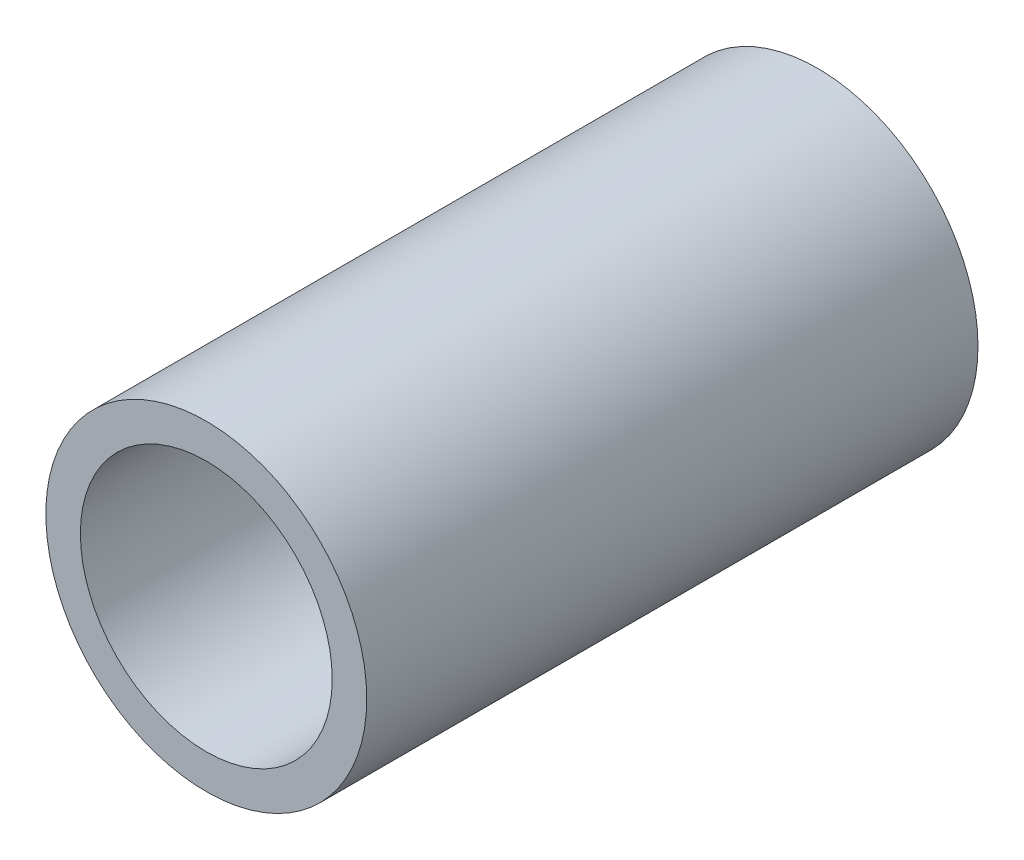
ISO-10303-21;
HEADER;
FILE_DESCRIPTION(('STEP AP214'),'2;1');
FILE_NAME('part.step','',(''),(''),'','','');
FILE_SCHEMA(('AUTOMOTIVE_DESIGN { 1 0 10303 214 1 1 1 1 }'));
ENDSEC;
DATA;
#1=APPLICATION_CONTEXT('core data for automotive mechanical design processes');
#2=APPLICATION_PROTOCOL_DEFINITION('international standard','automotive_design',2000,#1);
#3=PRODUCT_CONTEXT('',#1,'mechanical');
#4=PRODUCT('Part','Part','',(#3));
#5=PRODUCT_RELATED_PRODUCT_CATEGORY('part','',(#4));
#6=PRODUCT_DEFINITION_FORMATION('','',#4);
#7=PRODUCT_DEFINITION_CONTEXT('part definition',#1,'design');
#8=PRODUCT_DEFINITION('design','',#6,#7);
#9=PRODUCT_DEFINITION_SHAPE('','',#8);
#10=(LENGTH_UNIT() NAMED_UNIT(*) SI_UNIT(.MILLI.,.METRE.));
#11=(NAMED_UNIT(*) PLANE_ANGLE_UNIT() SI_UNIT($,.RADIAN.));
#12=(NAMED_UNIT(*) SI_UNIT($,.STERADIAN.) SOLID_ANGLE_UNIT());
#13=UNCERTAINTY_MEASURE_WITH_UNIT(LENGTH_MEASURE(1.E-05),#10,'distance_accuracy_value','');
#14=(GEOMETRIC_REPRESENTATION_CONTEXT(3) GLOBAL_UNCERTAINTY_ASSIGNED_CONTEXT((#13)) GLOBAL_UNIT_ASSIGNED_CONTEXT((#10,
#11,#12)) REPRESENTATION_CONTEXT('',''));
#15=CARTESIAN_POINT('',(0.,0.,0.));
#16=DIRECTION('',(0.,0.,1.));
#17=DIRECTION('',(1.,0.,0.));
#18=AXIS2_PLACEMENT_3D('',#15,#16,#17);
#19=CARTESIAN_POINT('',(0.,0.,25.4));
#20=DIRECTION('',(0.,0.,1.));
#21=DIRECTION('',(1.,0.,0.));
#22=AXIS2_PLACEMENT_3D('',#19,#20,#21);
#23=PLANE('',#22);
#24=CARTESIAN_POINT('',(0.,0.,25.4));
#25=DIRECTION('',(0.,0.,1.));
#26=DIRECTION('',(1.,0.,0.));
#27=AXIS2_PLACEMENT_3D('',#24,#25,#26);
#28=CIRCLE('',#27,13.335);
#29=CARTESIAN_POINT('',(13.335,0.,25.4));
#30=VERTEX_POINT('',#29);
#31=EDGE_CURVE('E10',#30,#30,#28,.T.);
#32=ORIENTED_EDGE('',*,*,#31,.T.);
#33=EDGE_LOOP('',(#32));
#34=FACE_BOUND('',#33,.T.);
#35=CARTESIAN_POINT('',(0.,0.,25.4));
#36=DIRECTION('',(0.,0.,1.));
#37=DIRECTION('',(1.,0.,0.));
#38=AXIS2_PLACEMENT_3D('',#35,#36,#37);
#39=CIRCLE('',#38,10.4648);
#40=CARTESIAN_POINT('',(10.4648,0.,25.4));
#41=VERTEX_POINT('',#40);
#42=EDGE_CURVE('E42',#41,#41,#39,.T.);
#43=ORIENTED_EDGE('',*,*,#42,.F.);
#44=EDGE_LOOP('',(#43));
#45=FACE_BOUND('',#44,.T.);
#46=ADVANCED_FACE('F31',(#34,#45),#23,.T.);
#47=CARTESIAN_POINT('',(0.,0.,-25.4));
#48=DIRECTION('',(0.,0.,1.));
#49=DIRECTION('',(1.,0.,0.));
#50=AXIS2_PLACEMENT_3D('',#47,#48,#49);
#51=PLANE('',#50);
#52=CARTESIAN_POINT('',(0.,0.,-25.4));
#53=DIRECTION('',(0.,0.,1.));
#54=DIRECTION('',(1.,0.,0.));
#55=AXIS2_PLACEMENT_3D('',#52,#53,#54);
#56=CIRCLE('',#55,13.335);
#57=CARTESIAN_POINT('',(13.335,0.,-25.4));
#58=VERTEX_POINT('',#57);
#59=EDGE_CURVE('E35',#58,#58,#56,.T.);
#60=ORIENTED_EDGE('',*,*,#59,.F.);
#61=EDGE_LOOP('',(#60));
#62=FACE_BOUND('',#61,.T.);
#63=CARTESIAN_POINT('',(0.,0.,-25.4));
#64=DIRECTION('',(0.,0.,1.));
#65=DIRECTION('',(1.,0.,0.));
#66=AXIS2_PLACEMENT_3D('',#63,#64,#65);
#67=CIRCLE('',#66,10.4648);
#68=CARTESIAN_POINT('',(10.4648,0.,-25.4));
#69=VERTEX_POINT('',#68);
#70=EDGE_CURVE('E44',#69,#69,#67,.T.);
#71=ORIENTED_EDGE('',*,*,#70,.T.);
#72=EDGE_LOOP('',(#71));
#73=FACE_BOUND('',#72,.T.);
#74=ADVANCED_FACE('F54',(#62,#73),#51,.F.);
#75=CARTESIAN_POINT('',(0.,0.,25.4));
#76=DIRECTION('',(0.,0.,-1.));
#77=DIRECTION('',(-1.,0.,0.));
#78=AXIS2_PLACEMENT_3D('',#75,#76,#77);
#79=CYLINDRICAL_SURFACE('',#78,13.335);
#80=ORIENTED_EDGE('',*,*,#31,.F.);
#81=EDGE_LOOP('',(#80));
#82=FACE_BOUND('',#81,.T.);
#83=ORIENTED_EDGE('',*,*,#59,.T.);
#84=EDGE_LOOP('',(#83));
#85=FACE_BOUND('',#84,.T.);
#86=ADVANCED_FACE('F33',(#82,#85),#79,.T.);
#87=CARTESIAN_POINT('',(0.,0.,25.4));
#88=DIRECTION('',(0.,0.,-1.));
#89=DIRECTION('',(-1.,0.,0.));
#90=AXIS2_PLACEMENT_3D('',#87,#88,#89);
#91=CYLINDRICAL_SURFACE('',#90,10.4648);
#92=ORIENTED_EDGE('',*,*,#42,.T.);
#93=EDGE_LOOP('',(#92));
#94=FACE_BOUND('',#93,.T.);
#95=ORIENTED_EDGE('',*,*,#70,.F.);
#96=EDGE_LOOP('',(#95));
#97=FACE_BOUND('',#96,.T.);
#98=ADVANCED_FACE('F50',(#94,#97),#91,.F.);
#99=CLOSED_SHELL('',(#46,#74,#86,#98));
#100=MANIFOLD_SOLID_BREP('B2',#99);
#101=ADVANCED_BREP_SHAPE_REPRESENTATION('',(#18,#100),#14);
#102=SHAPE_DEFINITION_REPRESENTATION(#9,#101);
ENDSEC;
END-ISO-10303-21;
